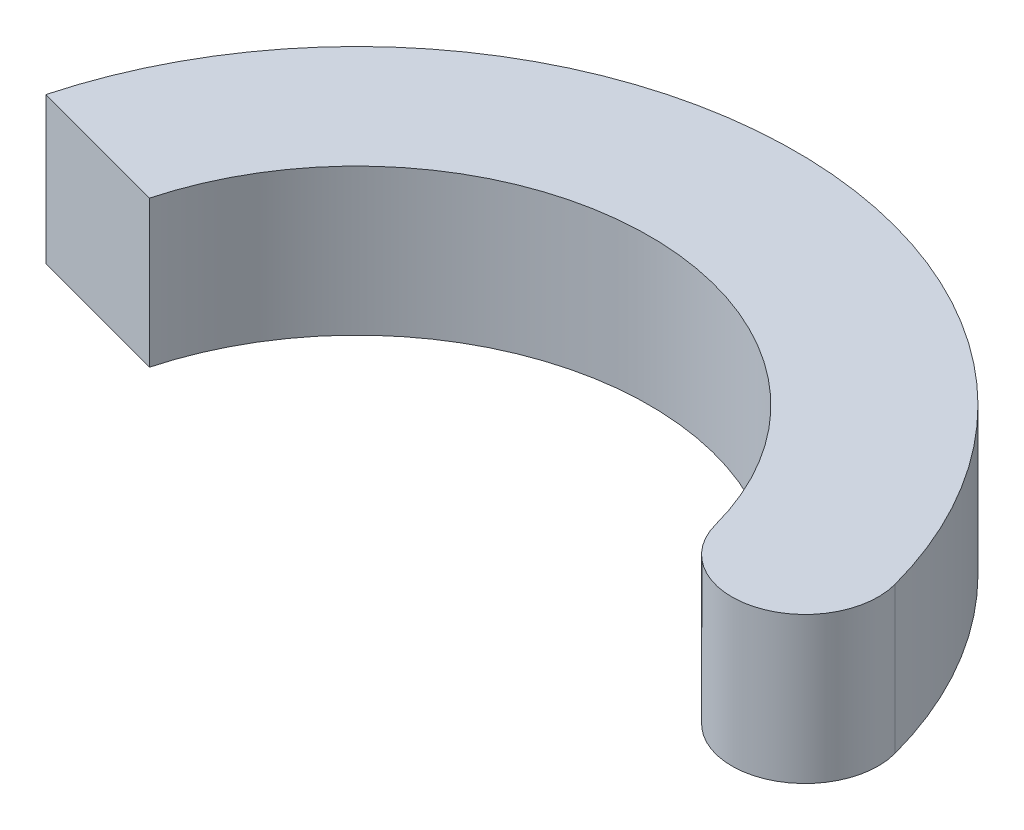
ISO-10303-21;
HEADER;
FILE_DESCRIPTION(('STEP AP214'),'2;1');
FILE_NAME('part.step','',(''),(''),'','','');
FILE_SCHEMA(('AUTOMOTIVE_DESIGN { 1 0 10303 214 1 1 1 1 }'));
ENDSEC;
DATA;
#1=APPLICATION_CONTEXT('core data for automotive mechanical design processes');
#2=APPLICATION_PROTOCOL_DEFINITION('international standard','automotive_design',2000,#1);
#3=PRODUCT_CONTEXT('',#1,'mechanical');
#4=PRODUCT('Part','Part','',(#3));
#5=PRODUCT_RELATED_PRODUCT_CATEGORY('part','',(#4));
#6=PRODUCT_DEFINITION_FORMATION('','',#4);
#7=PRODUCT_DEFINITION_CONTEXT('part definition',#1,'design');
#8=PRODUCT_DEFINITION('design','',#6,#7);
#9=PRODUCT_DEFINITION_SHAPE('','',#8);
#10=(LENGTH_UNIT() NAMED_UNIT(*) SI_UNIT(.MILLI.,.METRE.));
#11=(NAMED_UNIT(*) PLANE_ANGLE_UNIT() SI_UNIT($,.RADIAN.));
#12=(NAMED_UNIT(*) SI_UNIT($,.STERADIAN.) SOLID_ANGLE_UNIT());
#13=UNCERTAINTY_MEASURE_WITH_UNIT(LENGTH_MEASURE(1.E-05),#10,'distance_accuracy_value','');
#14=(GEOMETRIC_REPRESENTATION_CONTEXT(3) GLOBAL_UNCERTAINTY_ASSIGNED_CONTEXT((#13)) GLOBAL_UNIT_ASSIGNED_CONTEXT((#10,
#11,#12)) REPRESENTATION_CONTEXT('',''));
#15=CARTESIAN_POINT('',(0.,0.,0.));
#16=DIRECTION('',(0.,0.,1.));
#17=DIRECTION('',(1.,0.,0.));
#18=AXIS2_PLACEMENT_3D('',#15,#16,#17);
#19=CARTESIAN_POINT('',(0.,20.,0.));
#20=DIRECTION('',(-0.258819045102518,0.,0.965925826289069));
#21=DIRECTION('',(0.965925826289069,0.,0.258819045102518));
#22=AXIS2_PLACEMENT_3D('',#19,#20,#21);
#23=PLANE('',#22);
#24=DIRECTION('',(-0.965925826289069,0.,-0.258819045102518));
#25=VECTOR('',#24,1.);
#26=CARTESIAN_POINT('',(0.,0.,0.));
#27=LINE('',#26,#25);
#28=CARTESIAN_POINT('',(-38.6370330515628,0.,-10.3527618041007));
#29=VERTEX_POINT('',#28);
#30=CARTESIAN_POINT('',(-57.9555495773441,0.,-15.5291427061511));
#31=VERTEX_POINT('',#30);
#32=EDGE_CURVE('E104',#29,#31,#27,.T.);
#33=ORIENTED_EDGE('',*,*,#32,.F.);
#34=DIRECTION('',(0.,-1.,0.));
#35=VECTOR('',#34,1.);
#36=CARTESIAN_POINT('',(-38.6370330515628,20.,-10.3527618041007));
#37=LINE('',#36,#35);
#38=CARTESIAN_POINT('',(-38.6370330515628,20.,-10.3527618041007));
#39=VERTEX_POINT('',#38);
#40=EDGE_CURVE('E11',#39,#29,#37,.T.);
#41=ORIENTED_EDGE('',*,*,#40,.F.);
#42=DIRECTION('',(-0.965925826289069,0.,-0.258819045102518));
#43=VECTOR('',#42,1.);
#44=CARTESIAN_POINT('',(0.,20.,0.));
#45=LINE('',#44,#43);
#46=CARTESIAN_POINT('',(-57.9555495773441,20.,-15.5291427061511));
#47=VERTEX_POINT('',#46);
#48=EDGE_CURVE('E97',#39,#47,#45,.T.);
#49=ORIENTED_EDGE('',*,*,#48,.T.);
#50=DIRECTION('',(0.,-1.,0.));
#51=VECTOR('',#50,1.);
#52=CARTESIAN_POINT('',(-57.9555495773441,20.,-15.5291427061511));
#53=LINE('',#52,#51);
#54=EDGE_CURVE('E79',#47,#31,#53,.T.);
#55=ORIENTED_EDGE('',*,*,#54,.T.);
#56=EDGE_LOOP('',(#33,#41,#49,#55));
#57=FACE_BOUND('',#56,.T.);
#58=ADVANCED_FACE('F41',(#57),#23,.T.);
#59=CARTESIAN_POINT('',(0.,20.,0.));
#60=DIRECTION('',(0.,-1.,0.));
#61=DIRECTION('',(0.,0.,-1.));
#62=AXIS2_PLACEMENT_3D('',#59,#60,#61);
#63=CYLINDRICAL_SURFACE('',#62,40.);
#64=CARTESIAN_POINT('',(0.,0.,0.));
#65=DIRECTION('',(0.,1.,0.));
#66=DIRECTION('',(0.,0.,1.));
#67=AXIS2_PLACEMENT_3D('',#64,#65,#66);
#68=CIRCLE('',#67,40.);
#69=CARTESIAN_POINT('',(38.6370330515628,0.,-10.3527618041007));
#70=VERTEX_POINT('',#69);
#71=EDGE_CURVE('E90',#70,#29,#68,.T.);
#72=ORIENTED_EDGE('',*,*,#71,.F.);
#73=DIRECTION('',(0.,-1.,0.));
#74=VECTOR('',#73,1.);
#75=CARTESIAN_POINT('',(38.6370330515628,20.,-10.3527618041007));
#76=LINE('',#75,#74);
#77=CARTESIAN_POINT('',(38.6370330515628,20.,-10.3527618041007));
#78=VERTEX_POINT('',#77);
#79=EDGE_CURVE('E49',#78,#70,#76,.T.);
#80=ORIENTED_EDGE('',*,*,#79,.F.);
#81=CARTESIAN_POINT('',(0.,20.,0.));
#82=DIRECTION('',(0.,1.,0.));
#83=DIRECTION('',(0.,0.,1.));
#84=AXIS2_PLACEMENT_3D('',#81,#82,#83);
#85=CIRCLE('',#84,40.);
#86=EDGE_CURVE('E88',#78,#39,#85,.T.);
#87=ORIENTED_EDGE('',*,*,#86,.T.);
#88=ORIENTED_EDGE('',*,*,#40,.T.);
#89=EDGE_LOOP('',(#72,#80,#87,#88));
#90=FACE_BOUND('',#89,.T.);
#91=ADVANCED_FACE('F87',(#90),#63,.F.);
#92=CARTESIAN_POINT('',(48.2962913144535,20.,-12.9409522551259));
#93=DIRECTION('',(0.,-1.,0.));
#94=DIRECTION('',(0.,0.,-1.));
#95=AXIS2_PLACEMENT_3D('',#92,#93,#94);
#96=CYLINDRICAL_SURFACE('',#95,10.);
#97=CARTESIAN_POINT('',(48.2962913144535,0.,-12.9409522551259));
#98=DIRECTION('',(0.,1.,0.));
#99=DIRECTION('',(0.,0.,1.));
#100=AXIS2_PLACEMENT_3D('',#97,#98,#99);
#101=CIRCLE('',#100,10.);
#102=CARTESIAN_POINT('',(57.9555495773441,0.,-15.5291427061511));
#103=VERTEX_POINT('',#102);
#104=EDGE_CURVE('E108',#103,#70,#101,.F.);
#105=ORIENTED_EDGE('',*,*,#104,.F.);
#106=DIRECTION('',(0.,-1.,0.));
#107=VECTOR('',#106,1.);
#108=CARTESIAN_POINT('',(57.9555495773441,20.,-15.5291427061511));
#109=LINE('',#108,#107);
#110=CARTESIAN_POINT('',(57.9555495773441,20.,-15.5291427061511));
#111=VERTEX_POINT('',#110);
#112=EDGE_CURVE('E72',#111,#103,#109,.T.);
#113=ORIENTED_EDGE('',*,*,#112,.F.);
#114=CARTESIAN_POINT('',(48.2962913144535,20.,-12.9409522551259));
#115=DIRECTION('',(0.,1.,0.));
#116=DIRECTION('',(0.,0.,1.));
#117=AXIS2_PLACEMENT_3D('',#114,#115,#116);
#118=CIRCLE('',#117,10.);
#119=EDGE_CURVE('E96',#111,#78,#118,.F.);
#120=ORIENTED_EDGE('',*,*,#119,.T.);
#121=ORIENTED_EDGE('',*,*,#79,.T.);
#122=EDGE_LOOP('',(#105,#113,#120,#121));
#123=FACE_BOUND('',#122,.T.);
#124=ADVANCED_FACE('F99',(#123),#96,.T.);
#125=CARTESIAN_POINT('',(0.,20.,0.));
#126=DIRECTION('',(0.,-1.,0.));
#127=DIRECTION('',(0.,0.,-1.));
#128=AXIS2_PLACEMENT_3D('',#125,#126,#127);
#129=CYLINDRICAL_SURFACE('',#128,60.);
#130=CARTESIAN_POINT('',(0.,0.,0.));
#131=DIRECTION('',(0.,1.,0.));
#132=DIRECTION('',(0.,0.,1.));
#133=AXIS2_PLACEMENT_3D('',#130,#131,#132);
#134=CIRCLE('',#133,60.);
#135=EDGE_CURVE('E110',#103,#31,#134,.T.);
#136=ORIENTED_EDGE('',*,*,#135,.T.);
#137=ORIENTED_EDGE('',*,*,#54,.F.);
#138=CARTESIAN_POINT('',(0.,20.,0.));
#139=DIRECTION('',(0.,1.,0.));
#140=DIRECTION('',(0.,0.,1.));
#141=AXIS2_PLACEMENT_3D('',#138,#139,#140);
#142=CIRCLE('',#141,60.);
#143=EDGE_CURVE('E57',#111,#47,#142,.T.);
#144=ORIENTED_EDGE('',*,*,#143,.F.);
#145=ORIENTED_EDGE('',*,*,#112,.T.);
#146=EDGE_LOOP('',(#136,#137,#144,#145));
#147=FACE_BOUND('',#146,.T.);
#148=ADVANCED_FACE('F120',(#147),#129,.T.);
#149=CARTESIAN_POINT('',(0.,20.,0.));
#150=DIRECTION('',(0.,1.,0.));
#151=DIRECTION('',(0.,0.,1.));
#152=AXIS2_PLACEMENT_3D('',#149,#150,#151);
#153=PLANE('',#152);
#154=ORIENTED_EDGE('',*,*,#48,.F.);
#155=ORIENTED_EDGE('',*,*,#86,.F.);
#156=ORIENTED_EDGE('',*,*,#119,.F.);
#157=ORIENTED_EDGE('',*,*,#143,.T.);
#158=EDGE_LOOP('',(#154,#155,#156,#157));
#159=FACE_BOUND('',#158,.T.);
#160=ADVANCED_FACE('F95',(#159),#153,.T.);
#161=CARTESIAN_POINT('',(0.,0.,0.));
#162=DIRECTION('',(0.,1.,0.));
#163=DIRECTION('',(0.,0.,1.));
#164=AXIS2_PLACEMENT_3D('',#161,#162,#163);
#165=PLANE('',#164);
#166=ORIENTED_EDGE('',*,*,#32,.T.);
#167=ORIENTED_EDGE('',*,*,#135,.F.);
#168=ORIENTED_EDGE('',*,*,#104,.T.);
#169=ORIENTED_EDGE('',*,*,#71,.T.);
#170=EDGE_LOOP('',(#166,#167,#168,#169));
#171=FACE_BOUND('',#170,.T.);
#172=ADVANCED_FACE('F125',(#171),#165,.F.);
#173=CLOSED_SHELL('',(#58,#91,#124,#148,#160,#172));
#174=MANIFOLD_SOLID_BREP('B2',#173);
#175=ADVANCED_BREP_SHAPE_REPRESENTATION('',(#18,#174),#14);
#176=SHAPE_DEFINITION_REPRESENTATION(#9,#175);
ENDSEC;
END-ISO-10303-21;
